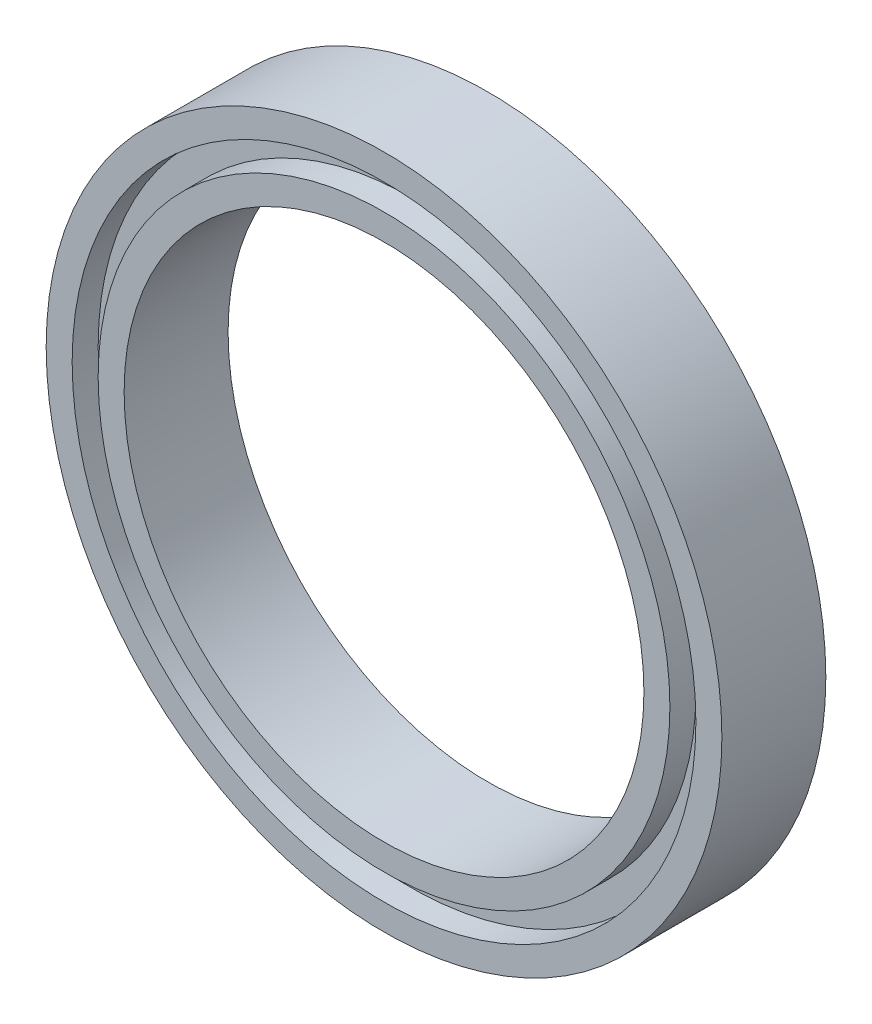
ISO-10303-21;
HEADER;
FILE_DESCRIPTION(('STEP AP214'),'2;1');
FILE_NAME('part.step','',(''),(''),'','','');
FILE_SCHEMA(('AUTOMOTIVE_DESIGN { 1 0 10303 214 1 1 1 1 }'));
ENDSEC;
DATA;
#1=APPLICATION_CONTEXT('core data for automotive mechanical design processes');
#2=APPLICATION_PROTOCOL_DEFINITION('international standard','automotive_design',2000,#1);
#3=PRODUCT_CONTEXT('',#1,'mechanical');
#4=PRODUCT('Part','Part','',(#3));
#5=PRODUCT_RELATED_PRODUCT_CATEGORY('part','',(#4));
#6=PRODUCT_DEFINITION_FORMATION('','',#4);
#7=PRODUCT_DEFINITION_CONTEXT('part definition',#1,'design');
#8=PRODUCT_DEFINITION('design','',#6,#7);
#9=PRODUCT_DEFINITION_SHAPE('','',#8);
#10=(LENGTH_UNIT() NAMED_UNIT(*) SI_UNIT(.MILLI.,.METRE.));
#11=(NAMED_UNIT(*) PLANE_ANGLE_UNIT() SI_UNIT($,.RADIAN.));
#12=(NAMED_UNIT(*) SI_UNIT($,.STERADIAN.) SOLID_ANGLE_UNIT());
#13=UNCERTAINTY_MEASURE_WITH_UNIT(LENGTH_MEASURE(1.E-05),#10,'distance_accuracy_value','');
#14=(GEOMETRIC_REPRESENTATION_CONTEXT(3) GLOBAL_UNCERTAINTY_ASSIGNED_CONTEXT((#13)) GLOBAL_UNIT_ASSIGNED_CONTEXT((#10,
#11,#12)) REPRESENTATION_CONTEXT('',''));
#15=CARTESIAN_POINT('',(0.,0.,0.));
#16=DIRECTION('',(0.,0.,1.));
#17=DIRECTION('',(1.,0.,0.));
#18=AXIS2_PLACEMENT_3D('',#15,#16,#17);
#19=CARTESIAN_POINT('',(0.,0.,10.));
#20=DIRECTION('',(0.,0.,1.));
#21=DIRECTION('',(1.,0.,0.));
#22=AXIS2_PLACEMENT_3D('',#19,#20,#21);
#23=PLANE('',#22);
#24=CARTESIAN_POINT('',(0.,0.,10.));
#25=DIRECTION('',(0.,0.,1.));
#26=DIRECTION('',(1.,0.,0.));
#27=AXIS2_PLACEMENT_3D('',#24,#25,#26);
#28=CIRCLE('',#27,25.);
#29=CARTESIAN_POINT('',(25.,0.,10.));
#30=VERTEX_POINT('',#29);
#31=EDGE_CURVE('E48',#30,#30,#28,.T.);
#32=ORIENTED_EDGE('',*,*,#31,.F.);
#33=EDGE_LOOP('',(#32));
#34=FACE_BOUND('',#33,.T.);
#35=CARTESIAN_POINT('',(0.,0.,10.));
#36=DIRECTION('',(0.,0.,1.));
#37=DIRECTION('',(1.,0.,0.));
#38=AXIS2_PLACEMENT_3D('',#35,#36,#37);
#39=CIRCLE('',#38,27.5);
#40=CARTESIAN_POINT('',(27.5,0.,10.));
#41=VERTEX_POINT('',#40);
#42=EDGE_CURVE('E62',#41,#41,#39,.T.);
#43=ORIENTED_EDGE('',*,*,#42,.T.);
#44=EDGE_LOOP('',(#43));
#45=FACE_BOUND('',#44,.T.);
#46=ADVANCED_FACE('F37',(#34,#45),#23,.T.);
#47=CARTESIAN_POINT('',(0.,0.,10.));
#48=DIRECTION('',(0.,0.,1.));
#49=DIRECTION('',(1.,0.,0.));
#50=AXIS2_PLACEMENT_3D('',#47,#48,#49);
#51=CIRCLE('',#50,30.);
#52=CARTESIAN_POINT('',(30.,0.,10.));
#53=VERTEX_POINT('',#52);
#54=EDGE_CURVE('E56',#53,#53,#51,.T.);
#55=ORIENTED_EDGE('',*,*,#54,.F.);
#56=EDGE_LOOP('',(#55));
#57=FACE_BOUND('',#56,.T.);
#58=CARTESIAN_POINT('',(0.,0.,10.));
#59=DIRECTION('',(0.,0.,1.));
#60=DIRECTION('',(1.,0.,0.));
#61=AXIS2_PLACEMENT_3D('',#58,#59,#60);
#62=CIRCLE('',#61,32.5);
#63=CARTESIAN_POINT('',(32.5,0.,10.));
#64=VERTEX_POINT('',#63);
#65=EDGE_CURVE('E10',#64,#64,#62,.T.);
#66=ORIENTED_EDGE('',*,*,#65,.T.);
#67=EDGE_LOOP('',(#66));
#68=FACE_BOUND('',#67,.T.);
#69=ADVANCED_FACE('F84',(#57,#68),#23,.T.);
#70=CARTESIAN_POINT('',(0.,0.,0.));
#71=DIRECTION('',(0.,0.,1.));
#72=DIRECTION('',(1.,0.,0.));
#73=AXIS2_PLACEMENT_3D('',#70,#71,#72);
#74=PLANE('',#73);
#75=CARTESIAN_POINT('',(0.,0.,0.));
#76=DIRECTION('',(0.,0.,1.));
#77=DIRECTION('',(1.,0.,0.));
#78=AXIS2_PLACEMENT_3D('',#75,#76,#77);
#79=CIRCLE('',#78,32.5);
#80=CARTESIAN_POINT('',(32.5,0.,0.));
#81=VERTEX_POINT('',#80);
#82=EDGE_CURVE('E41',#81,#81,#79,.T.);
#83=ORIENTED_EDGE('',*,*,#82,.F.);
#84=EDGE_LOOP('',(#83));
#85=FACE_BOUND('',#84,.T.);
#86=CARTESIAN_POINT('',(0.,0.,0.));
#87=DIRECTION('',(0.,0.,1.));
#88=DIRECTION('',(1.,0.,0.));
#89=AXIS2_PLACEMENT_3D('',#86,#87,#88);
#90=CIRCLE('',#89,25.);
#91=CARTESIAN_POINT('',(25.,0.,0.));
#92=VERTEX_POINT('',#91);
#93=EDGE_CURVE('E50',#92,#92,#90,.T.);
#94=ORIENTED_EDGE('',*,*,#93,.T.);
#95=EDGE_LOOP('',(#94));
#96=FACE_BOUND('',#95,.T.);
#97=ADVANCED_FACE('F86',(#85,#96),#74,.F.);
#98=CARTESIAN_POINT('',(0.,0.,10.));
#99=DIRECTION('',(0.,0.,-1.));
#100=DIRECTION('',(-1.,0.,0.));
#101=AXIS2_PLACEMENT_3D('',#98,#99,#100);
#102=CYLINDRICAL_SURFACE('',#101,32.5);
#103=ORIENTED_EDGE('',*,*,#65,.F.);
#104=EDGE_LOOP('',(#103));
#105=FACE_BOUND('',#104,.T.);
#106=ORIENTED_EDGE('',*,*,#82,.T.);
#107=EDGE_LOOP('',(#106));
#108=FACE_BOUND('',#107,.T.);
#109=ADVANCED_FACE('F39',(#105,#108),#102,.T.);
#110=CARTESIAN_POINT('',(0.,0.,10.));
#111=DIRECTION('',(0.,0.,-1.));
#112=DIRECTION('',(-1.,0.,0.));
#113=AXIS2_PLACEMENT_3D('',#110,#111,#112);
#114=CYLINDRICAL_SURFACE('',#113,25.);
#115=ORIENTED_EDGE('',*,*,#31,.T.);
#116=EDGE_LOOP('',(#115));
#117=FACE_BOUND('',#116,.T.);
#118=ORIENTED_EDGE('',*,*,#93,.F.);
#119=EDGE_LOOP('',(#118));
#120=FACE_BOUND('',#119,.T.);
#121=ADVANCED_FACE('F80',(#117,#120),#114,.F.);
#122=CARTESIAN_POINT('',(0.,0.,7.5));
#123=DIRECTION('',(0.,0.,1.));
#124=DIRECTION('',(1.,0.,0.));
#125=AXIS2_PLACEMENT_3D('',#122,#123,#124);
#126=CYLINDRICAL_SURFACE('',#125,30.);
#127=CARTESIAN_POINT('',(0.,0.,7.5));
#128=DIRECTION('',(0.,0.,1.));
#129=DIRECTION('',(1.,0.,0.));
#130=AXIS2_PLACEMENT_3D('',#127,#128,#129);
#131=CIRCLE('',#130,30.);
#132=CARTESIAN_POINT('',(30.,0.,7.5));
#133=VERTEX_POINT('',#132);
#134=EDGE_CURVE('E53',#133,#133,#131,.T.);
#135=ORIENTED_EDGE('',*,*,#134,.F.);
#136=EDGE_LOOP('',(#135));
#137=FACE_BOUND('',#136,.T.);
#138=ORIENTED_EDGE('',*,*,#54,.T.);
#139=EDGE_LOOP('',(#138));
#140=FACE_BOUND('',#139,.T.);
#141=ADVANCED_FACE('F74',(#137,#140),#126,.F.);
#142=CARTESIAN_POINT('',(0.,0.,7.5));
#143=DIRECTION('',(0.,0.,1.));
#144=DIRECTION('',(1.,0.,0.));
#145=AXIS2_PLACEMENT_3D('',#142,#143,#144);
#146=PLANE('',#145);
#147=CARTESIAN_POINT('',(0.,0.,7.5));
#148=DIRECTION('',(0.,0.,1.));
#149=DIRECTION('',(1.,0.,0.));
#150=AXIS2_PLACEMENT_3D('',#147,#148,#149);
#151=CIRCLE('',#150,27.5);
#152=CARTESIAN_POINT('',(27.5,0.,7.5));
#153=VERTEX_POINT('',#152);
#154=EDGE_CURVE('E59',#153,#153,#151,.T.);
#155=ORIENTED_EDGE('',*,*,#154,.F.);
#156=EDGE_LOOP('',(#155));
#157=FACE_BOUND('',#156,.T.);
#158=ORIENTED_EDGE('',*,*,#134,.T.);
#159=EDGE_LOOP('',(#158));
#160=FACE_BOUND('',#159,.T.);
#161=ADVANCED_FACE('F71',(#157,#160),#146,.T.);
#162=CARTESIAN_POINT('',(0.,0.,7.5));
#163=DIRECTION('',(0.,0.,1.));
#164=DIRECTION('',(1.,0.,0.));
#165=AXIS2_PLACEMENT_3D('',#162,#163,#164);
#166=CYLINDRICAL_SURFACE('',#165,27.5);
#167=ORIENTED_EDGE('',*,*,#154,.T.);
#168=EDGE_LOOP('',(#167));
#169=FACE_BOUND('',#168,.T.);
#170=ORIENTED_EDGE('',*,*,#42,.F.);
#171=EDGE_LOOP('',(#170));
#172=FACE_BOUND('',#171,.T.);
#173=ADVANCED_FACE('F68',(#169,#172),#166,.T.);
#174=CLOSED_SHELL('',(#46,#69,#97,#109,#121,#141,#161,#173));
#175=MANIFOLD_SOLID_BREP('B2',#174);
#176=ADVANCED_BREP_SHAPE_REPRESENTATION('',(#18,#175),#14);
#177=SHAPE_DEFINITION_REPRESENTATION(#9,#176);
ENDSEC;
END-ISO-10303-21;
